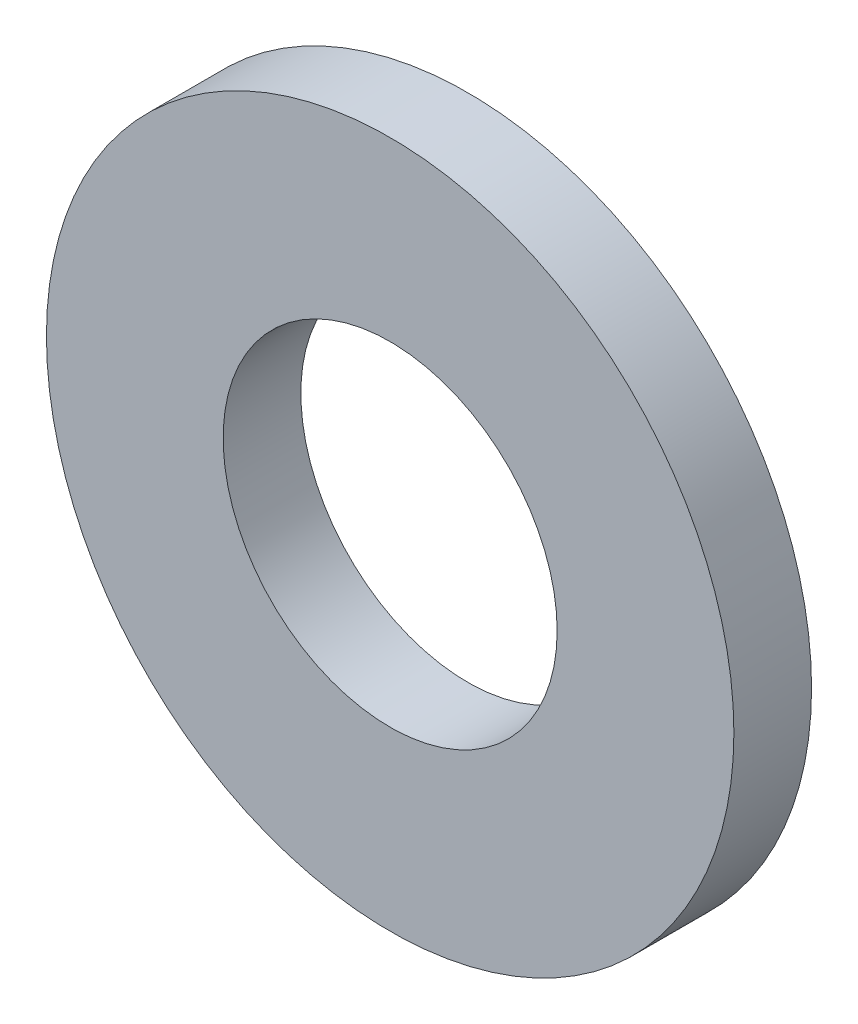
ISO-10303-21;
HEADER;
FILE_DESCRIPTION(('STEP AP214'),'2;1');
FILE_NAME('part.step','',(''),(''),'','','');
FILE_SCHEMA(('AUTOMOTIVE_DESIGN { 1 0 10303 214 1 1 1 1 }'));
ENDSEC;
DATA;
#1=APPLICATION_CONTEXT('core data for automotive mechanical design processes');
#2=APPLICATION_PROTOCOL_DEFINITION('international standard','automotive_design',2000,#1);
#3=PRODUCT_CONTEXT('',#1,'mechanical');
#4=PRODUCT('Part','Part','',(#3));
#5=PRODUCT_RELATED_PRODUCT_CATEGORY('part','',(#4));
#6=PRODUCT_DEFINITION_FORMATION('','',#4);
#7=PRODUCT_DEFINITION_CONTEXT('part definition',#1,'design');
#8=PRODUCT_DEFINITION('design','',#6,#7);
#9=PRODUCT_DEFINITION_SHAPE('','',#8);
#10=(LENGTH_UNIT() NAMED_UNIT(*) SI_UNIT(.MILLI.,.METRE.));
#11=(NAMED_UNIT(*) PLANE_ANGLE_UNIT() SI_UNIT($,.RADIAN.));
#12=(NAMED_UNIT(*) SI_UNIT($,.STERADIAN.) SOLID_ANGLE_UNIT());
#13=UNCERTAINTY_MEASURE_WITH_UNIT(LENGTH_MEASURE(1.E-05),#10,'distance_accuracy_value','');
#14=(GEOMETRIC_REPRESENTATION_CONTEXT(3) GLOBAL_UNCERTAINTY_ASSIGNED_CONTEXT((#13)) GLOBAL_UNIT_ASSIGNED_CONTEXT((#10,
#11,#12)) REPRESENTATION_CONTEXT('',''));
#15=CARTESIAN_POINT('',(0.,0.,0.));
#16=DIRECTION('',(0.,0.,1.));
#17=DIRECTION('',(1.,0.,0.));
#18=AXIS2_PLACEMENT_3D('',#15,#16,#17);
#19=CARTESIAN_POINT('',(0.,0.,1.));
#20=DIRECTION('',(0.,0.,1.));
#21=DIRECTION('',(1.,0.,0.));
#22=AXIS2_PLACEMENT_3D('',#19,#20,#21);
#23=PLANE('',#22);
#24=CARTESIAN_POINT('',(0.,0.,1.));
#25=DIRECTION('',(0.,0.,1.));
#26=DIRECTION('',(1.,0.,0.));
#27=AXIS2_PLACEMENT_3D('',#24,#25,#26);
#28=CIRCLE('',#27,4.425);
#29=CARTESIAN_POINT('',(4.425,0.,1.));
#30=VERTEX_POINT('',#29);
#31=EDGE_CURVE('E10',#30,#30,#28,.T.);
#32=ORIENTED_EDGE('',*,*,#31,.T.);
#33=EDGE_LOOP('',(#32));
#34=FACE_BOUND('',#33,.T.);
#35=CARTESIAN_POINT('',(0.,0.,1.));
#36=DIRECTION('',(0.,0.,1.));
#37=DIRECTION('',(1.,0.,0.));
#38=AXIS2_PLACEMENT_3D('',#35,#36,#37);
#39=CIRCLE('',#38,2.15);
#40=CARTESIAN_POINT('',(2.15,0.,1.));
#41=VERTEX_POINT('',#40);
#42=EDGE_CURVE('E46',#41,#41,#39,.T.);
#43=ORIENTED_EDGE('',*,*,#42,.F.);
#44=EDGE_LOOP('',(#43));
#45=FACE_BOUND('',#44,.T.);
#46=ADVANCED_FACE('F35',(#34,#45),#23,.T.);
#47=CARTESIAN_POINT('',(0.,0.,0.));
#48=DIRECTION('',(0.,0.,1.));
#49=DIRECTION('',(1.,0.,0.));
#50=AXIS2_PLACEMENT_3D('',#47,#48,#49);
#51=PLANE('',#50);
#52=CARTESIAN_POINT('',(0.,0.,0.));
#53=DIRECTION('',(0.,0.,1.));
#54=DIRECTION('',(1.,0.,0.));
#55=AXIS2_PLACEMENT_3D('',#52,#53,#54);
#56=CIRCLE('',#55,4.425);
#57=CARTESIAN_POINT('',(4.425,0.,0.));
#58=VERTEX_POINT('',#57);
#59=EDGE_CURVE('E39',#58,#58,#56,.T.);
#60=ORIENTED_EDGE('',*,*,#59,.F.);
#61=EDGE_LOOP('',(#60));
#62=FACE_BOUND('',#61,.T.);
#63=CARTESIAN_POINT('',(0.,0.,0.));
#64=DIRECTION('',(0.,0.,1.));
#65=DIRECTION('',(1.,0.,0.));
#66=AXIS2_PLACEMENT_3D('',#63,#64,#65);
#67=CIRCLE('',#66,2.15);
#68=CARTESIAN_POINT('',(2.15,0.,0.));
#69=VERTEX_POINT('',#68);
#70=EDGE_CURVE('E48',#69,#69,#67,.T.);
#71=ORIENTED_EDGE('',*,*,#70,.T.);
#72=EDGE_LOOP('',(#71));
#73=FACE_BOUND('',#72,.T.);
#74=ADVANCED_FACE('F58',(#62,#73),#51,.F.);
#75=CARTESIAN_POINT('',(0.,0.,1.));
#76=DIRECTION('',(0.,0.,-1.));
#77=DIRECTION('',(-1.,0.,0.));
#78=AXIS2_PLACEMENT_3D('',#75,#76,#77);
#79=CYLINDRICAL_SURFACE('',#78,4.425);
#80=ORIENTED_EDGE('',*,*,#31,.F.);
#81=EDGE_LOOP('',(#80));
#82=FACE_BOUND('',#81,.T.);
#83=ORIENTED_EDGE('',*,*,#59,.T.);
#84=EDGE_LOOP('',(#83));
#85=FACE_BOUND('',#84,.T.);
#86=ADVANCED_FACE('F37',(#82,#85),#79,.T.);
#87=CARTESIAN_POINT('',(0.,0.,1.));
#88=DIRECTION('',(0.,0.,-1.));
#89=DIRECTION('',(-1.,0.,0.));
#90=AXIS2_PLACEMENT_3D('',#87,#88,#89);
#91=CYLINDRICAL_SURFACE('',#90,2.15);
#92=ORIENTED_EDGE('',*,*,#42,.T.);
#93=EDGE_LOOP('',(#92));
#94=FACE_BOUND('',#93,.T.);
#95=ORIENTED_EDGE('',*,*,#70,.F.);
#96=EDGE_LOOP('',(#95));
#97=FACE_BOUND('',#96,.T.);
#98=ADVANCED_FACE('F54',(#94,#97),#91,.F.);
#99=CLOSED_SHELL('',(#46,#74,#86,#98));
#100=MANIFOLD_SOLID_BREP('B2',#99);
#101=ADVANCED_BREP_SHAPE_REPRESENTATION('',(#18,#100),#14);
#102=SHAPE_DEFINITION_REPRESENTATION(#9,#101);
ENDSEC;
END-ISO-10303-21;
